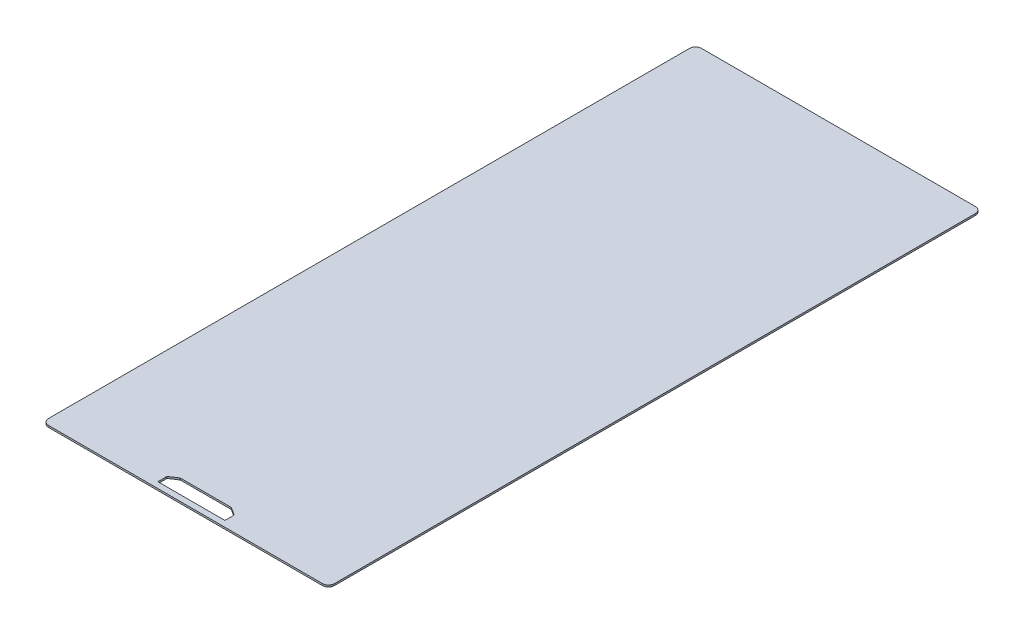
ISO-10303-21;
HEADER;
FILE_DESCRIPTION(('STEP AP214'),'2;1');
FILE_NAME('part.step','',(''),(''),'','','');
FILE_SCHEMA(('AUTOMOTIVE_DESIGN { 1 0 10303 214 1 1 1 1 }'));
ENDSEC;
DATA;
#1=APPLICATION_CONTEXT('core data for automotive mechanical design processes');
#2=APPLICATION_PROTOCOL_DEFINITION('international standard','automotive_design',2000,#1);
#3=PRODUCT_CONTEXT('',#1,'mechanical');
#4=PRODUCT('Part','Part','',(#3));
#5=PRODUCT_RELATED_PRODUCT_CATEGORY('part','',(#4));
#6=PRODUCT_DEFINITION_FORMATION('','',#4);
#7=PRODUCT_DEFINITION_CONTEXT('part definition',#1,'design');
#8=PRODUCT_DEFINITION('design','',#6,#7);
#9=PRODUCT_DEFINITION_SHAPE('','',#8);
#10=(LENGTH_UNIT() NAMED_UNIT(*) SI_UNIT(.MILLI.,.METRE.));
#11=(NAMED_UNIT(*) PLANE_ANGLE_UNIT() SI_UNIT($,.RADIAN.));
#12=(NAMED_UNIT(*) SI_UNIT($,.STERADIAN.) SOLID_ANGLE_UNIT());
#13=UNCERTAINTY_MEASURE_WITH_UNIT(LENGTH_MEASURE(1.E-05),#10,'distance_accuracy_value','');
#14=(GEOMETRIC_REPRESENTATION_CONTEXT(3) GLOBAL_UNCERTAINTY_ASSIGNED_CONTEXT((#13)) GLOBAL_UNIT_ASSIGNED_CONTEXT((#10,
#11,#12)) REPRESENTATION_CONTEXT('',''));
#15=CARTESIAN_POINT('',(0.,0.,0.));
#16=DIRECTION('',(0.,0.,1.));
#17=DIRECTION('',(1.,0.,0.));
#18=AXIS2_PLACEMENT_3D('',#15,#16,#17);
#19=CARTESIAN_POINT('',(231.5,3.,541.5));
#20=DIRECTION('',(0.,-1.,0.));
#21=DIRECTION('',(0.,0.,-1.));
#22=AXIS2_PLACEMENT_3D('',#19,#20,#21);
#23=CYLINDRICAL_SURFACE('',#22,10.);
#24=CARTESIAN_POINT('',(231.5,0.,541.5));
#25=DIRECTION('',(0.,1.,0.));
#26=DIRECTION('',(0.,0.,1.));
#27=AXIS2_PLACEMENT_3D('',#24,#25,#26);
#28=CIRCLE('',#27,10.);
#29=CARTESIAN_POINT('',(231.5,0.,551.5));
#30=VERTEX_POINT('',#29);
#31=CARTESIAN_POINT('',(241.5,0.,541.5));
#32=VERTEX_POINT('',#31);
#33=EDGE_CURVE('E254',#30,#32,#28,.T.);
#34=ORIENTED_EDGE('',*,*,#33,.T.);
#35=DIRECTION('',(0.,-1.,0.));
#36=VECTOR('',#35,1.);
#37=CARTESIAN_POINT('',(241.5,3.,541.5));
#38=LINE('',#37,#36);
#39=CARTESIAN_POINT('',(241.5,3.,541.5));
#40=VERTEX_POINT('',#39);
#41=EDGE_CURVE('E11',#40,#32,#38,.T.);
#42=ORIENTED_EDGE('',*,*,#41,.F.);
#43=CARTESIAN_POINT('',(231.5,3.,541.5));
#44=DIRECTION('',(0.,1.,0.));
#45=DIRECTION('',(0.,0.,1.));
#46=AXIS2_PLACEMENT_3D('',#43,#44,#45);
#47=CIRCLE('',#46,10.);
#48=CARTESIAN_POINT('',(231.5,3.,551.5));
#49=VERTEX_POINT('',#48);
#50=EDGE_CURVE('E278',#49,#40,#47,.T.);
#51=ORIENTED_EDGE('',*,*,#50,.F.);
#52=DIRECTION('',(0.,-1.,0.));
#53=VECTOR('',#52,1.);
#54=CARTESIAN_POINT('',(231.5,3.,551.5));
#55=LINE('',#54,#53);
#56=EDGE_CURVE('E304',#49,#30,#55,.T.);
#57=ORIENTED_EDGE('',*,*,#56,.T.);
#58=EDGE_LOOP('',(#34,#42,#51,#57));
#59=FACE_BOUND('',#58,.T.);
#60=ADVANCED_FACE('F38',(#59),#23,.T.);
#61=CARTESIAN_POINT('',(241.5,3.,541.5));
#62=DIRECTION('',(-1.,0.,0.));
#63=DIRECTION('',(0.,0.,1.));
#64=AXIS2_PLACEMENT_3D('',#61,#62,#63);
#65=PLANE('',#64);
#66=DIRECTION('',(0.,0.,-1.));
#67=VECTOR('',#66,1.);
#68=CARTESIAN_POINT('',(241.5,0.,541.5));
#69=LINE('',#68,#67);
#70=CARTESIAN_POINT('',(241.5,0.,-541.5));
#71=VERTEX_POINT('',#70);
#72=EDGE_CURVE('E308',#32,#71,#69,.T.);
#73=ORIENTED_EDGE('',*,*,#72,.T.);
#74=DIRECTION('',(0.,-1.,0.));
#75=VECTOR('',#74,1.);
#76=CARTESIAN_POINT('',(241.5,3.,-541.5));
#77=LINE('',#76,#75);
#78=CARTESIAN_POINT('',(241.5,3.,-541.5));
#79=VERTEX_POINT('',#78);
#80=EDGE_CURVE('E46',#79,#71,#77,.T.);
#81=ORIENTED_EDGE('',*,*,#80,.F.);
#82=DIRECTION('',(0.,0.,-1.));
#83=VECTOR('',#82,1.);
#84=CARTESIAN_POINT('',(241.5,3.,541.5));
#85=LINE('',#84,#83);
#86=EDGE_CURVE('E282',#40,#79,#85,.T.);
#87=ORIENTED_EDGE('',*,*,#86,.F.);
#88=ORIENTED_EDGE('',*,*,#41,.T.);
#89=EDGE_LOOP('',(#73,#81,#87,#88));
#90=FACE_BOUND('',#89,.T.);
#91=ADVANCED_FACE('F377',(#90),#65,.F.);
#92=CARTESIAN_POINT('',(231.5,3.,-541.5));
#93=DIRECTION('',(0.,-1.,0.));
#94=DIRECTION('',(0.,0.,-1.));
#95=AXIS2_PLACEMENT_3D('',#92,#93,#94);
#96=CYLINDRICAL_SURFACE('',#95,10.);
#97=CARTESIAN_POINT('',(231.5,0.,-541.5));
#98=DIRECTION('',(0.,1.,0.));
#99=DIRECTION('',(0.,0.,-1.));
#100=AXIS2_PLACEMENT_3D('',#97,#98,#99);
#101=CIRCLE('',#100,10.);
#102=CARTESIAN_POINT('',(231.5,0.,-551.5));
#103=VERTEX_POINT('',#102);
#104=EDGE_CURVE('E311',#71,#103,#101,.T.);
#105=ORIENTED_EDGE('',*,*,#104,.T.);
#106=DIRECTION('',(0.,-1.,0.));
#107=VECTOR('',#106,1.);
#108=CARTESIAN_POINT('',(231.5,3.,-551.5));
#109=LINE('',#108,#107);
#110=CARTESIAN_POINT('',(231.5,3.,-551.5));
#111=VERTEX_POINT('',#110);
#112=EDGE_CURVE('E347',#111,#103,#109,.T.);
#113=ORIENTED_EDGE('',*,*,#112,.F.);
#114=CARTESIAN_POINT('',(231.5,3.,-541.5));
#115=DIRECTION('',(0.,1.,0.));
#116=DIRECTION('',(0.,0.,-1.));
#117=AXIS2_PLACEMENT_3D('',#114,#115,#116);
#118=CIRCLE('',#117,10.);
#119=EDGE_CURVE('E286',#79,#111,#118,.T.);
#120=ORIENTED_EDGE('',*,*,#119,.F.);
#121=ORIENTED_EDGE('',*,*,#80,.T.);
#122=EDGE_LOOP('',(#105,#113,#120,#121));
#123=FACE_BOUND('',#122,.T.);
#124=ADVANCED_FACE('F356',(#123),#96,.T.);
#125=CARTESIAN_POINT('',(-231.5,3.,-551.5));
#126=DIRECTION('',(0.,0.,1.));
#127=DIRECTION('',(1.,0.,0.));
#128=AXIS2_PLACEMENT_3D('',#125,#126,#127);
#129=PLANE('',#128);
#130=DIRECTION('',(-1.,0.,0.));
#131=VECTOR('',#130,1.);
#132=CARTESIAN_POINT('',(-231.5,0.,-551.5));
#133=LINE('',#132,#131);
#134=CARTESIAN_POINT('',(-231.5,0.,-551.5));
#135=VERTEX_POINT('',#134);
#136=EDGE_CURVE('E314',#103,#135,#133,.T.);
#137=ORIENTED_EDGE('',*,*,#136,.T.);
#138=DIRECTION('',(0.,-1.,0.));
#139=VECTOR('',#138,1.);
#140=CARTESIAN_POINT('',(-231.5,3.,-551.5));
#141=LINE('',#140,#139);
#142=CARTESIAN_POINT('',(-231.5,3.,-551.5));
#143=VERTEX_POINT('',#142);
#144=EDGE_CURVE('E343',#143,#135,#141,.T.);
#145=ORIENTED_EDGE('',*,*,#144,.F.);
#146=DIRECTION('',(-1.,0.,0.));
#147=VECTOR('',#146,1.);
#148=CARTESIAN_POINT('',(-231.5,3.,-551.5));
#149=LINE('',#148,#147);
#150=EDGE_CURVE('E289',#111,#143,#149,.T.);
#151=ORIENTED_EDGE('',*,*,#150,.F.);
#152=ORIENTED_EDGE('',*,*,#112,.T.);
#153=EDGE_LOOP('',(#137,#145,#151,#152));
#154=FACE_BOUND('',#153,.T.);
#155=ADVANCED_FACE('F365',(#154),#129,.F.);
#156=CARTESIAN_POINT('',(-231.5,3.,-541.5));
#157=DIRECTION('',(0.,-1.,0.));
#158=DIRECTION('',(0.,0.,-1.));
#159=AXIS2_PLACEMENT_3D('',#156,#157,#158);
#160=CYLINDRICAL_SURFACE('',#159,10.);
#161=CARTESIAN_POINT('',(-231.5,0.,-541.5));
#162=DIRECTION('',(0.,1.,0.));
#163=DIRECTION('',(0.,0.,-1.));
#164=AXIS2_PLACEMENT_3D('',#161,#162,#163);
#165=CIRCLE('',#164,10.);
#166=CARTESIAN_POINT('',(-241.5,0.,-541.5));
#167=VERTEX_POINT('',#166);
#168=EDGE_CURVE('E317',#135,#167,#165,.T.);
#169=ORIENTED_EDGE('',*,*,#168,.T.);
#170=DIRECTION('',(0.,-1.,0.));
#171=VECTOR('',#170,1.);
#172=CARTESIAN_POINT('',(-241.5,3.,-541.5));
#173=LINE('',#172,#171);
#174=CARTESIAN_POINT('',(-241.5,3.,-541.5));
#175=VERTEX_POINT('',#174);
#176=EDGE_CURVE('E339',#175,#167,#173,.T.);
#177=ORIENTED_EDGE('',*,*,#176,.F.);
#178=CARTESIAN_POINT('',(-231.5,3.,-541.5));
#179=DIRECTION('',(0.,1.,0.));
#180=DIRECTION('',(0.,0.,-1.));
#181=AXIS2_PLACEMENT_3D('',#178,#179,#180);
#182=CIRCLE('',#181,10.);
#183=EDGE_CURVE('E292',#143,#175,#182,.T.);
#184=ORIENTED_EDGE('',*,*,#183,.F.);
#185=ORIENTED_EDGE('',*,*,#144,.T.);
#186=EDGE_LOOP('',(#169,#177,#184,#185));
#187=FACE_BOUND('',#186,.T.);
#188=ADVANCED_FACE('F369',(#187),#160,.T.);
#189=CARTESIAN_POINT('',(-241.5,3.,541.5));
#190=DIRECTION('',(1.,0.,0.));
#191=DIRECTION('',(0.,0.,-1.));
#192=AXIS2_PLACEMENT_3D('',#189,#190,#191);
#193=PLANE('',#192);
#194=DIRECTION('',(0.,0.,1.));
#195=VECTOR('',#194,1.);
#196=CARTESIAN_POINT('',(-241.5,0.,541.5));
#197=LINE('',#196,#195);
#198=CARTESIAN_POINT('',(-241.5,0.,541.5));
#199=VERTEX_POINT('',#198);
#200=EDGE_CURVE('E320',#167,#199,#197,.T.);
#201=ORIENTED_EDGE('',*,*,#200,.T.);
#202=DIRECTION('',(0.,-1.,0.));
#203=VECTOR('',#202,1.);
#204=CARTESIAN_POINT('',(-241.5,3.,541.5));
#205=LINE('',#204,#203);
#206=CARTESIAN_POINT('',(-241.5,3.,541.5));
#207=VERTEX_POINT('',#206);
#208=EDGE_CURVE('E335',#207,#199,#205,.T.);
#209=ORIENTED_EDGE('',*,*,#208,.F.);
#210=DIRECTION('',(0.,0.,1.));
#211=VECTOR('',#210,1.);
#212=CARTESIAN_POINT('',(-241.5,3.,541.5));
#213=LINE('',#212,#211);
#214=EDGE_CURVE('E295',#175,#207,#213,.T.);
#215=ORIENTED_EDGE('',*,*,#214,.F.);
#216=ORIENTED_EDGE('',*,*,#176,.T.);
#217=EDGE_LOOP('',(#201,#209,#215,#216));
#218=FACE_BOUND('',#217,.T.);
#219=ADVANCED_FACE('F390',(#218),#193,.F.);
#220=CARTESIAN_POINT('',(-231.5,3.,541.5));
#221=DIRECTION('',(0.,-1.,0.));
#222=DIRECTION('',(0.,0.,-1.));
#223=AXIS2_PLACEMENT_3D('',#220,#221,#222);
#224=CYLINDRICAL_SURFACE('',#223,10.);
#225=CARTESIAN_POINT('',(-231.5,0.,541.5));
#226=DIRECTION('',(0.,1.,0.));
#227=DIRECTION('',(0.,0.,-1.));
#228=AXIS2_PLACEMENT_3D('',#225,#226,#227);
#229=CIRCLE('',#228,10.);
#230=CARTESIAN_POINT('',(-231.5,0.,551.5));
#231=VERTEX_POINT('',#230);
#232=EDGE_CURVE('E323',#199,#231,#229,.T.);
#233=ORIENTED_EDGE('',*,*,#232,.T.);
#234=DIRECTION('',(0.,-1.,0.));
#235=VECTOR('',#234,1.);
#236=CARTESIAN_POINT('',(-231.5,3.,551.5));
#237=LINE('',#236,#235);
#238=CARTESIAN_POINT('',(-231.5,3.,551.5));
#239=VERTEX_POINT('',#238);
#240=EDGE_CURVE('E331',#239,#231,#237,.T.);
#241=ORIENTED_EDGE('',*,*,#240,.F.);
#242=CARTESIAN_POINT('',(-231.5,3.,541.5));
#243=DIRECTION('',(0.,1.,0.));
#244=DIRECTION('',(0.,0.,-1.));
#245=AXIS2_PLACEMENT_3D('',#242,#243,#244);
#246=CIRCLE('',#245,10.);
#247=EDGE_CURVE('E298',#207,#239,#246,.T.);
#248=ORIENTED_EDGE('',*,*,#247,.F.);
#249=ORIENTED_EDGE('',*,*,#208,.T.);
#250=EDGE_LOOP('',(#233,#241,#248,#249));
#251=FACE_BOUND('',#250,.T.);
#252=ADVANCED_FACE('F388',(#251),#224,.T.);
#253=CARTESIAN_POINT('',(-231.5,3.,551.5));
#254=DIRECTION('',(0.,0.,-1.));
#255=DIRECTION('',(-1.,0.,0.));
#256=AXIS2_PLACEMENT_3D('',#253,#254,#255);
#257=PLANE('',#256);
#258=DIRECTION('',(1.,0.,0.));
#259=VECTOR('',#258,1.);
#260=CARTESIAN_POINT('',(-231.5,0.,551.5));
#261=LINE('',#260,#259);
#262=EDGE_CURVE('E283',#231,#30,#261,.T.);
#263=ORIENTED_EDGE('',*,*,#262,.T.);
#264=ORIENTED_EDGE('',*,*,#56,.F.);
#265=DIRECTION('',(1.,0.,0.));
#266=VECTOR('',#265,1.);
#267=CARTESIAN_POINT('',(-231.5,3.,551.5));
#268=LINE('',#267,#266);
#269=EDGE_CURVE('E301',#239,#49,#268,.T.);
#270=ORIENTED_EDGE('',*,*,#269,.F.);
#271=ORIENTED_EDGE('',*,*,#240,.T.);
#272=EDGE_LOOP('',(#263,#264,#270,#271));
#273=FACE_BOUND('',#272,.T.);
#274=ADVANCED_FACE('F383',(#273),#257,.F.);
#275=CARTESIAN_POINT('',(231.5,3.,541.5));
#276=DIRECTION('',(0.,1.,0.));
#277=DIRECTION('',(0.,0.,1.));
#278=AXIS2_PLACEMENT_3D('',#275,#276,#277);
#279=PLANE('',#278);
#280=DIRECTION('',(0.,0.,-1.));
#281=VECTOR('',#280,1.);
#282=CARTESIAN_POINT('',(56.625,3.,541.5));
#283=LINE('',#282,#281);
#284=CARTESIAN_POINT('',(56.625,3.,541.5));
#285=VERTEX_POINT('',#284);
#286=CARTESIAN_POINT('',(56.625,3.,527.33991835621));
#287=VERTEX_POINT('',#286);
#288=EDGE_CURVE('E53',#285,#287,#283,.T.);
#289=ORIENTED_EDGE('',*,*,#288,.F.);
#290=DIRECTION('',(1.,0.,0.));
#291=VECTOR('',#290,1.);
#292=CARTESIAN_POINT('',(-56.625,3.,541.5));
#293=LINE('',#292,#291);
#294=CARTESIAN_POINT('',(-56.625,3.,541.5));
#295=VERTEX_POINT('',#294);
#296=EDGE_CURVE('E185',#295,#285,#293,.T.);
#297=ORIENTED_EDGE('',*,*,#296,.F.);
#298=DIRECTION('',(0.,0.,1.));
#299=VECTOR('',#298,1.);
#300=CARTESIAN_POINT('',(-56.625,3.,527.33991835621));
#301=LINE('',#300,#299);
#302=CARTESIAN_POINT('',(-56.625,3.,527.33991835621));
#303=VERTEX_POINT('',#302);
#304=EDGE_CURVE('E189',#303,#295,#301,.T.);
#305=ORIENTED_EDGE('',*,*,#304,.F.);
#306=CARTESIAN_POINT('',(-54.125,3.,527.33991835621));
#307=DIRECTION('',(0.,1.,0.));
#308=DIRECTION('',(0.,0.,1.));
#309=AXIS2_PLACEMENT_3D('',#306,#307,#308);
#310=CIRCLE('',#309,2.49999999999999);
#311=CARTESIAN_POINT('',(-55.5092162003361,3.,525.258105321683));
#312=VERTEX_POINT('',#311);
#313=EDGE_CURVE('E244',#312,#303,#310,.T.);
#314=ORIENTED_EDGE('',*,*,#313,.F.);
#315=DIRECTION('',(-0.832725213810864,0.,0.553686480134427));
#316=VECTOR('',#315,1.);
#317=CARTESIAN_POINT('',(-43.9303352342589,3.,517.559203283322));
#318=LINE('',#317,#316);
#319=CARTESIAN_POINT('',(-43.9303352342589,3.,517.559203283322));
#320=VERTEX_POINT('',#319);
#321=EDGE_CURVE('E240',#320,#312,#318,.T.);
#322=ORIENTED_EDGE('',*,*,#321,.F.);
#323=CARTESIAN_POINT('',(-42.5461190339228,3.,519.641016317849));
#324=DIRECTION('',(0.,1.,0.));
#325=DIRECTION('',(0.,0.,1.));
#326=AXIS2_PLACEMENT_3D('',#323,#324,#325);
#327=CIRCLE('',#326,2.49999999999997);
#328=CARTESIAN_POINT('',(-42.5461190339228,3.,517.141016317849));
#329=VERTEX_POINT('',#328);
#330=EDGE_CURVE('E236',#329,#320,#327,.T.);
#331=ORIENTED_EDGE('',*,*,#330,.F.);
#332=DIRECTION('',(-1.,0.,0.));
#333=VECTOR('',#332,1.);
#334=CARTESIAN_POINT('',(42.5461190339228,3.,517.141016317849));
#335=LINE('',#334,#333);
#336=CARTESIAN_POINT('',(42.5461190339228,3.,517.141016317849));
#337=VERTEX_POINT('',#336);
#338=EDGE_CURVE('E232',#337,#329,#335,.T.);
#339=ORIENTED_EDGE('',*,*,#338,.F.);
#340=CARTESIAN_POINT('',(42.5461190339228,3.,519.641016317849));
#341=DIRECTION('',(0.,1.,0.));
#342=DIRECTION('',(0.,0.,1.));
#343=AXIS2_PLACEMENT_3D('',#340,#341,#342);
#344=CIRCLE('',#343,2.49999999999997);
#345=CARTESIAN_POINT('',(43.9303352342589,3.,517.559203283322));
#346=VERTEX_POINT('',#345);
#347=EDGE_CURVE('E228',#346,#337,#344,.T.);
#348=ORIENTED_EDGE('',*,*,#347,.F.);
#349=DIRECTION('',(-0.832725213810864,0.,-0.553686480134427));
#350=VECTOR('',#349,1.);
#351=CARTESIAN_POINT('',(55.509216200336,3.,525.258105321683));
#352=LINE('',#351,#350);
#353=CARTESIAN_POINT('',(55.509216200336,3.,525.258105321683));
#354=VERTEX_POINT('',#353);
#355=EDGE_CURVE('E224',#354,#346,#352,.T.);
#356=ORIENTED_EDGE('',*,*,#355,.F.);
#357=CARTESIAN_POINT('',(54.125,3.,527.33991835621));
#358=DIRECTION('',(0.,1.,0.));
#359=DIRECTION('',(0.,0.,1.));
#360=AXIS2_PLACEMENT_3D('',#357,#358,#359);
#361=CIRCLE('',#360,2.49999999999999);
#362=EDGE_CURVE('E221',#287,#354,#361,.T.);
#363=ORIENTED_EDGE('',*,*,#362,.F.);
#364=EDGE_LOOP('',(#289,#297,#305,#314,#322,#331,#339,#348,#356,#363));
#365=FACE_BOUND('',#364,.T.);
#366=ORIENTED_EDGE('',*,*,#50,.T.);
#367=ORIENTED_EDGE('',*,*,#86,.T.);
#368=ORIENTED_EDGE('',*,*,#119,.T.);
#369=ORIENTED_EDGE('',*,*,#150,.T.);
#370=ORIENTED_EDGE('',*,*,#183,.T.);
#371=ORIENTED_EDGE('',*,*,#214,.T.);
#372=ORIENTED_EDGE('',*,*,#247,.T.);
#373=ORIENTED_EDGE('',*,*,#269,.T.);
#374=EDGE_LOOP('',(#366,#367,#368,#369,#370,#371,#372,#373));
#375=FACE_BOUND('',#374,.T.);
#376=ADVANCED_FACE('F373',(#365,#375),#279,.T.);
#377=CARTESIAN_POINT('',(231.5,0.,541.5));
#378=DIRECTION('',(0.,1.,0.));
#379=DIRECTION('',(0.,0.,1.));
#380=AXIS2_PLACEMENT_3D('',#377,#378,#379);
#381=PLANE('',#380);
#382=DIRECTION('',(1.,0.,0.));
#383=VECTOR('',#382,1.);
#384=CARTESIAN_POINT('',(-56.625,0.,541.5));
#385=LINE('',#384,#383);
#386=CARTESIAN_POINT('',(-56.625,0.,541.5));
#387=VERTEX_POINT('',#386);
#388=CARTESIAN_POINT('',(56.625,0.,541.5));
#389=VERTEX_POINT('',#388);
#390=EDGE_CURVE('E172',#387,#389,#385,.T.);
#391=ORIENTED_EDGE('',*,*,#390,.T.);
#392=DIRECTION('',(0.,0.,-1.));
#393=VECTOR('',#392,1.);
#394=CARTESIAN_POINT('',(56.625,0.,541.5));
#395=LINE('',#394,#393);
#396=CARTESIAN_POINT('',(56.625,0.,527.33991835621));
#397=VERTEX_POINT('',#396);
#398=EDGE_CURVE('E165',#389,#397,#395,.T.);
#399=ORIENTED_EDGE('',*,*,#398,.T.);
#400=CARTESIAN_POINT('',(54.125,0.,527.33991835621));
#401=DIRECTION('',(0.,1.,0.));
#402=DIRECTION('',(0.,0.,1.));
#403=AXIS2_PLACEMENT_3D('',#400,#401,#402);
#404=CIRCLE('',#403,2.49999999999999);
#405=CARTESIAN_POINT('',(55.5092162003361,0.,525.258105321683));
#406=VERTEX_POINT('',#405);
#407=EDGE_CURVE('E175',#397,#406,#404,.T.);
#408=ORIENTED_EDGE('',*,*,#407,.T.);
#409=DIRECTION('',(-0.832725213810864,0.,-0.553686480134427));
#410=VECTOR('',#409,1.);
#411=CARTESIAN_POINT('',(55.509216200336,0.,525.258105321683));
#412=LINE('',#411,#410);
#413=CARTESIAN_POINT('',(43.9303352342589,0.,517.559203283322));
#414=VERTEX_POINT('',#413);
#415=EDGE_CURVE('E61',#406,#414,#412,.T.);
#416=ORIENTED_EDGE('',*,*,#415,.T.);
#417=CARTESIAN_POINT('',(42.5461190339228,0.,519.641016317849));
#418=DIRECTION('',(0.,1.,0.));
#419=DIRECTION('',(0.,0.,1.));
#420=AXIS2_PLACEMENT_3D('',#417,#418,#419);
#421=CIRCLE('',#420,2.49999999999997);
#422=CARTESIAN_POINT('',(42.5461190339228,0.,517.141016317849));
#423=VERTEX_POINT('',#422);
#424=EDGE_CURVE('E194',#414,#423,#421,.T.);
#425=ORIENTED_EDGE('',*,*,#424,.T.);
#426=DIRECTION('',(-1.,0.,0.));
#427=VECTOR('',#426,1.);
#428=CARTESIAN_POINT('',(42.5461190339228,0.,517.141016317849));
#429=LINE('',#428,#427);
#430=CARTESIAN_POINT('',(-42.5461190339228,0.,517.141016317849));
#431=VERTEX_POINT('',#430);
#432=EDGE_CURVE('E198',#423,#431,#429,.T.);
#433=ORIENTED_EDGE('',*,*,#432,.T.);
#434=CARTESIAN_POINT('',(-42.5461190339228,0.,519.641016317849));
#435=DIRECTION('',(0.,1.,0.));
#436=DIRECTION('',(0.,0.,1.));
#437=AXIS2_PLACEMENT_3D('',#434,#435,#436);
#438=CIRCLE('',#437,2.49999999999997);
#439=CARTESIAN_POINT('',(-43.9303352342589,0.,517.559203283322));
#440=VERTEX_POINT('',#439);
#441=EDGE_CURVE('E202',#431,#440,#438,.T.);
#442=ORIENTED_EDGE('',*,*,#441,.T.);
#443=DIRECTION('',(-0.832725213810864,0.,0.553686480134427));
#444=VECTOR('',#443,1.);
#445=CARTESIAN_POINT('',(-43.9303352342589,0.,517.559203283322));
#446=LINE('',#445,#444);
#447=CARTESIAN_POINT('',(-55.5092162003361,0.,525.258105321683));
#448=VERTEX_POINT('',#447);
#449=EDGE_CURVE('E206',#440,#448,#446,.T.);
#450=ORIENTED_EDGE('',*,*,#449,.T.);
#451=CARTESIAN_POINT('',(-54.125,0.,527.33991835621));
#452=DIRECTION('',(0.,1.,0.));
#453=DIRECTION('',(0.,0.,1.));
#454=AXIS2_PLACEMENT_3D('',#451,#452,#453);
#455=CIRCLE('',#454,2.49999999999999);
#456=CARTESIAN_POINT('',(-56.625,0.,527.33991835621));
#457=VERTEX_POINT('',#456);
#458=EDGE_CURVE('E210',#448,#457,#455,.T.);
#459=ORIENTED_EDGE('',*,*,#458,.T.);
#460=DIRECTION('',(0.,0.,1.));
#461=VECTOR('',#460,1.);
#462=CARTESIAN_POINT('',(-56.625,0.,527.33991835621));
#463=LINE('',#462,#461);
#464=EDGE_CURVE('E214',#457,#387,#463,.T.);
#465=ORIENTED_EDGE('',*,*,#464,.T.);
#466=EDGE_LOOP('',(#391,#399,#408,#416,#425,#433,#442,#450,#459,#465));
#467=FACE_BOUND('',#466,.T.);
#468=ORIENTED_EDGE('',*,*,#33,.F.);
#469=ORIENTED_EDGE('',*,*,#262,.F.);
#470=ORIENTED_EDGE('',*,*,#232,.F.);
#471=ORIENTED_EDGE('',*,*,#200,.F.);
#472=ORIENTED_EDGE('',*,*,#168,.F.);
#473=ORIENTED_EDGE('',*,*,#136,.F.);
#474=ORIENTED_EDGE('',*,*,#104,.F.);
#475=ORIENTED_EDGE('',*,*,#72,.F.);
#476=EDGE_LOOP('',(#468,#469,#470,#471,#472,#473,#474,#475));
#477=FACE_BOUND('',#476,.T.);
#478=ADVANCED_FACE('F180',(#467,#477),#381,.F.);
#479=CARTESIAN_POINT('',(56.625,0.,541.5));
#480=DIRECTION('',(1.,0.,0.));
#481=DIRECTION('',(0.,0.,-1.));
#482=AXIS2_PLACEMENT_3D('',#479,#480,#481);
#483=PLANE('',#482);
#484=ORIENTED_EDGE('',*,*,#288,.T.);
#485=DIRECTION('',(0.,1.,0.));
#486=VECTOR('',#485,1.);
#487=CARTESIAN_POINT('',(56.625,0.,527.33991835621));
#488=LINE('',#487,#486);
#489=EDGE_CURVE('E161',#397,#287,#488,.T.);
#490=ORIENTED_EDGE('',*,*,#489,.F.);
#491=ORIENTED_EDGE('',*,*,#398,.F.);
#492=DIRECTION('',(0.,1.,0.));
#493=VECTOR('',#492,1.);
#494=CARTESIAN_POINT('',(56.625,0.,541.5));
#495=LINE('',#494,#493);
#496=EDGE_CURVE('E251',#389,#285,#495,.T.);
#497=ORIENTED_EDGE('',*,*,#496,.T.);
#498=EDGE_LOOP('',(#484,#490,#491,#497));
#499=FACE_BOUND('',#498,.T.);
#500=ADVANCED_FACE('F163',(#499),#483,.F.);
#501=CARTESIAN_POINT('',(-56.625,0.,541.5));
#502=DIRECTION('',(0.,0.,1.));
#503=DIRECTION('',(1.,0.,0.));
#504=AXIS2_PLACEMENT_3D('',#501,#502,#503);
#505=PLANE('',#504);
#506=ORIENTED_EDGE('',*,*,#296,.T.);
#507=ORIENTED_EDGE('',*,*,#496,.F.);
#508=ORIENTED_EDGE('',*,*,#390,.F.);
#509=DIRECTION('',(0.,1.,0.));
#510=VECTOR('',#509,1.);
#511=CARTESIAN_POINT('',(-56.625,0.,541.5));
#512=LINE('',#511,#510);
#513=EDGE_CURVE('E255',#387,#295,#512,.T.);
#514=ORIENTED_EDGE('',*,*,#513,.T.);
#515=EDGE_LOOP('',(#506,#507,#508,#514));
#516=FACE_BOUND('',#515,.T.);
#517=ADVANCED_FACE('F457',(#516),#505,.F.);
#518=CARTESIAN_POINT('',(-56.625,0.,527.33991835621));
#519=DIRECTION('',(-1.,0.,0.));
#520=DIRECTION('',(0.,0.,1.));
#521=AXIS2_PLACEMENT_3D('',#518,#519,#520);
#522=PLANE('',#521);
#523=ORIENTED_EDGE('',*,*,#304,.T.);
#524=ORIENTED_EDGE('',*,*,#513,.F.);
#525=ORIENTED_EDGE('',*,*,#464,.F.);
#526=DIRECTION('',(0.,1.,0.));
#527=VECTOR('',#526,1.);
#528=CARTESIAN_POINT('',(-56.625,0.,527.33991835621));
#529=LINE('',#528,#527);
#530=EDGE_CURVE('E258',#457,#303,#529,.T.);
#531=ORIENTED_EDGE('',*,*,#530,.T.);
#532=EDGE_LOOP('',(#523,#524,#525,#531));
#533=FACE_BOUND('',#532,.T.);
#534=ADVANCED_FACE('F466',(#533),#522,.F.);
#535=CARTESIAN_POINT('',(-54.125,0.,527.33991835621));
#536=DIRECTION('',(0.,1.,0.));
#537=DIRECTION('',(0.,0.,1.));
#538=AXIS2_PLACEMENT_3D('',#535,#536,#537);
#539=CYLINDRICAL_SURFACE('',#538,2.49999999999999);
#540=ORIENTED_EDGE('',*,*,#313,.T.);
#541=ORIENTED_EDGE('',*,*,#530,.F.);
#542=ORIENTED_EDGE('',*,*,#458,.F.);
#543=DIRECTION('',(0.,1.,0.));
#544=VECTOR('',#543,1.);
#545=CARTESIAN_POINT('',(-55.5092162003361,0.,525.258105321683));
#546=LINE('',#545,#544);
#547=EDGE_CURVE('E261',#448,#312,#546,.T.);
#548=ORIENTED_EDGE('',*,*,#547,.T.);
#549=EDGE_LOOP('',(#540,#541,#542,#548));
#550=FACE_BOUND('',#549,.T.);
#551=ADVANCED_FACE('F476',(#550),#539,.F.);
#552=CARTESIAN_POINT('',(-43.9303352342589,0.,517.559203283322));
#553=DIRECTION('',(-0.553686480134427,0.,-0.832725213810864));
#554=DIRECTION('',(-0.832725213810864,0.,0.553686480134427));
#555=AXIS2_PLACEMENT_3D('',#552,#553,#554);
#556=PLANE('',#555);
#557=ORIENTED_EDGE('',*,*,#321,.T.);
#558=ORIENTED_EDGE('',*,*,#547,.F.);
#559=ORIENTED_EDGE('',*,*,#449,.F.);
#560=DIRECTION('',(0.,1.,0.));
#561=VECTOR('',#560,1.);
#562=CARTESIAN_POINT('',(-43.9303352342589,0.,517.559203283322));
#563=LINE('',#562,#561);
#564=EDGE_CURVE('E264',#440,#320,#563,.T.);
#565=ORIENTED_EDGE('',*,*,#564,.T.);
#566=EDGE_LOOP('',(#557,#558,#559,#565));
#567=FACE_BOUND('',#566,.T.);
#568=ADVANCED_FACE('F486',(#567),#556,.F.);
#569=CARTESIAN_POINT('',(-42.5461190339228,0.,519.641016317849));
#570=DIRECTION('',(0.,1.,0.));
#571=DIRECTION('',(0.,0.,1.));
#572=AXIS2_PLACEMENT_3D('',#569,#570,#571);
#573=CYLINDRICAL_SURFACE('',#572,2.49999999999997);
#574=ORIENTED_EDGE('',*,*,#330,.T.);
#575=ORIENTED_EDGE('',*,*,#564,.F.);
#576=ORIENTED_EDGE('',*,*,#441,.F.);
#577=DIRECTION('',(0.,1.,0.));
#578=VECTOR('',#577,1.);
#579=CARTESIAN_POINT('',(-42.5461190339228,0.,517.141016317849));
#580=LINE('',#579,#578);
#581=EDGE_CURVE('E267',#431,#329,#580,.T.);
#582=ORIENTED_EDGE('',*,*,#581,.T.);
#583=EDGE_LOOP('',(#574,#575,#576,#582));
#584=FACE_BOUND('',#583,.T.);
#585=ADVANCED_FACE('F496',(#584),#573,.F.);
#586=CARTESIAN_POINT('',(42.5461190339228,0.,517.141016317849));
#587=DIRECTION('',(0.,0.,-1.));
#588=DIRECTION('',(-1.,0.,0.));
#589=AXIS2_PLACEMENT_3D('',#586,#587,#588);
#590=PLANE('',#589);
#591=ORIENTED_EDGE('',*,*,#338,.T.);
#592=ORIENTED_EDGE('',*,*,#581,.F.);
#593=ORIENTED_EDGE('',*,*,#432,.F.);
#594=DIRECTION('',(0.,1.,0.));
#595=VECTOR('',#594,1.);
#596=CARTESIAN_POINT('',(42.5461190339228,0.,517.141016317849));
#597=LINE('',#596,#595);
#598=EDGE_CURVE('E270',#423,#337,#597,.T.);
#599=ORIENTED_EDGE('',*,*,#598,.T.);
#600=EDGE_LOOP('',(#591,#592,#593,#599));
#601=FACE_BOUND('',#600,.T.);
#602=ADVANCED_FACE('F506',(#601),#590,.F.);
#603=CARTESIAN_POINT('',(42.5461190339228,0.,519.641016317849));
#604=DIRECTION('',(0.,1.,0.));
#605=DIRECTION('',(0.,0.,1.));
#606=AXIS2_PLACEMENT_3D('',#603,#604,#605);
#607=CYLINDRICAL_SURFACE('',#606,2.49999999999997);
#608=ORIENTED_EDGE('',*,*,#347,.T.);
#609=ORIENTED_EDGE('',*,*,#598,.F.);
#610=ORIENTED_EDGE('',*,*,#424,.F.);
#611=DIRECTION('',(0.,1.,0.));
#612=VECTOR('',#611,1.);
#613=CARTESIAN_POINT('',(43.9303352342589,0.,517.559203283322));
#614=LINE('',#613,#612);
#615=EDGE_CURVE('E273',#414,#346,#614,.T.);
#616=ORIENTED_EDGE('',*,*,#615,.T.);
#617=EDGE_LOOP('',(#608,#609,#610,#616));
#618=FACE_BOUND('',#617,.T.);
#619=ADVANCED_FACE('F516',(#618),#607,.F.);
#620=CARTESIAN_POINT('',(55.509216200336,0.,525.258105321683));
#621=DIRECTION('',(0.553686480134427,0.,-0.832725213810864));
#622=DIRECTION('',(-0.832725213810864,0.,-0.553686480134427));
#623=AXIS2_PLACEMENT_3D('',#620,#621,#622);
#624=PLANE('',#623);
#625=ORIENTED_EDGE('',*,*,#355,.T.);
#626=ORIENTED_EDGE('',*,*,#615,.F.);
#627=ORIENTED_EDGE('',*,*,#415,.F.);
#628=DIRECTION('',(0.,1.,0.));
#629=VECTOR('',#628,1.);
#630=CARTESIAN_POINT('',(55.509216200336,0.,525.258105321683));
#631=LINE('',#630,#629);
#632=EDGE_CURVE('E171',#406,#354,#631,.T.);
#633=ORIENTED_EDGE('',*,*,#632,.T.);
#634=EDGE_LOOP('',(#625,#626,#627,#633));
#635=FACE_BOUND('',#634,.T.);
#636=ADVANCED_FACE('F526',(#635),#624,.F.);
#637=CARTESIAN_POINT('',(54.125,0.,527.33991835621));
#638=DIRECTION('',(0.,1.,0.));
#639=DIRECTION('',(0.,0.,1.));
#640=AXIS2_PLACEMENT_3D('',#637,#638,#639);
#641=CYLINDRICAL_SURFACE('',#640,2.49999999999999);
#642=ORIENTED_EDGE('',*,*,#362,.T.);
#643=ORIENTED_EDGE('',*,*,#632,.F.);
#644=ORIENTED_EDGE('',*,*,#407,.F.);
#645=ORIENTED_EDGE('',*,*,#489,.T.);
#646=EDGE_LOOP('',(#642,#643,#644,#645));
#647=FACE_BOUND('',#646,.T.);
#648=ADVANCED_FACE('F176',(#647),#641,.F.);
#649=CLOSED_SHELL('',(#60,#91,#124,#155,#188,#219,#252,#274,#376,#478,#500,#517,#534,#551,#568,
#585,#602,#619,#636,#648));
#650=MANIFOLD_SOLID_BREP('B2',#649);
#651=ADVANCED_BREP_SHAPE_REPRESENTATION('',(#18,#650),#14);
#652=SHAPE_DEFINITION_REPRESENTATION(#9,#651);
ENDSEC;
END-ISO-10303-21;
